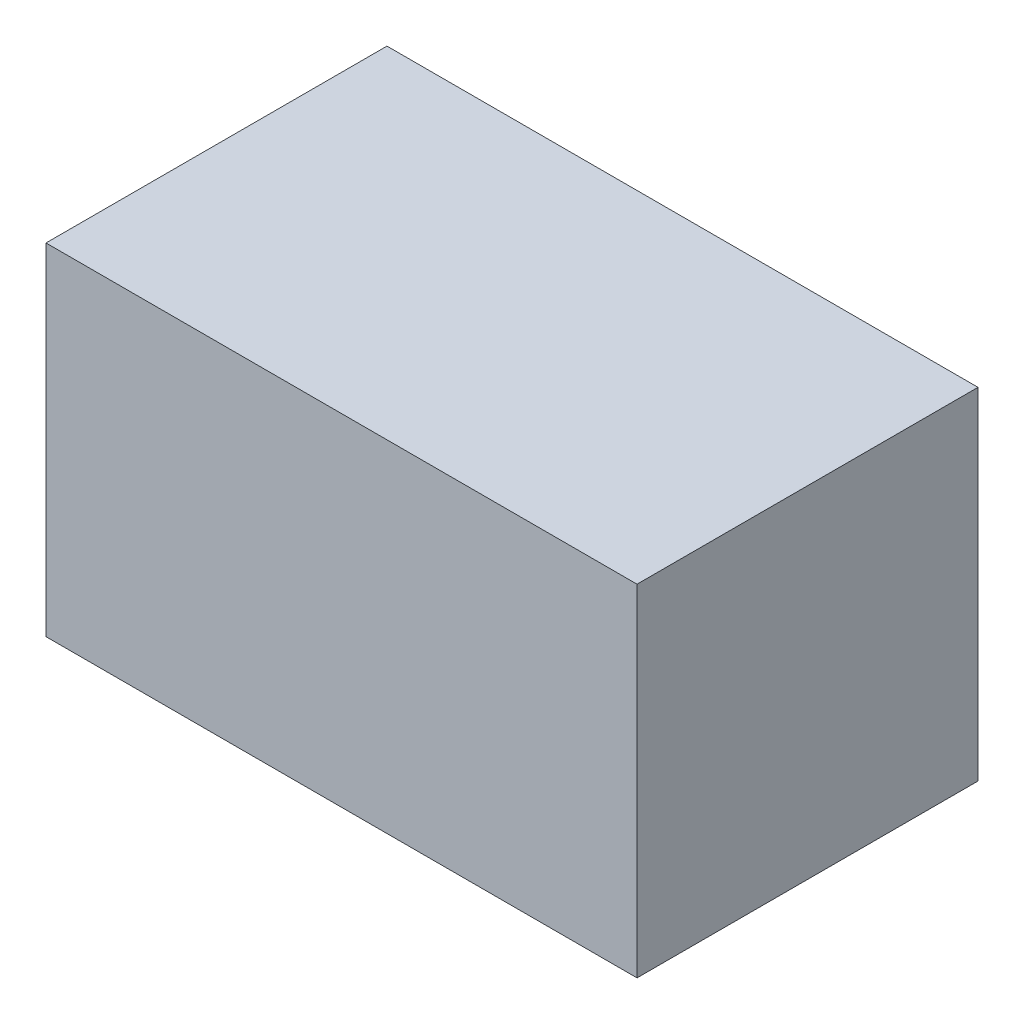
ISO-10303-21;
HEADER;
FILE_DESCRIPTION(('STEP AP214'),'2;1');
FILE_NAME('part.step','',(''),(''),'','','');
FILE_SCHEMA(('AUTOMOTIVE_DESIGN { 1 0 10303 214 1 1 1 1 }'));
ENDSEC;
DATA;
#1=APPLICATION_CONTEXT('core data for automotive mechanical design processes');
#2=APPLICATION_PROTOCOL_DEFINITION('international standard','automotive_design',2000,#1);
#3=PRODUCT_CONTEXT('',#1,'mechanical');
#4=PRODUCT('Part','Part','',(#3));
#5=PRODUCT_RELATED_PRODUCT_CATEGORY('part','',(#4));
#6=PRODUCT_DEFINITION_FORMATION('','',#4);
#7=PRODUCT_DEFINITION_CONTEXT('part definition',#1,'design');
#8=PRODUCT_DEFINITION('design','',#6,#7);
#9=PRODUCT_DEFINITION_SHAPE('','',#8);
#10=(LENGTH_UNIT() NAMED_UNIT(*) SI_UNIT(.MILLI.,.METRE.));
#11=(NAMED_UNIT(*) PLANE_ANGLE_UNIT() SI_UNIT($,.RADIAN.));
#12=(NAMED_UNIT(*) SI_UNIT($,.STERADIAN.) SOLID_ANGLE_UNIT());
#13=UNCERTAINTY_MEASURE_WITH_UNIT(LENGTH_MEASURE(1.E-05),#10,'distance_accuracy_value','');
#14=(GEOMETRIC_REPRESENTATION_CONTEXT(3) GLOBAL_UNCERTAINTY_ASSIGNED_CONTEXT((#13)) GLOBAL_UNIT_ASSIGNED_CONTEXT((#10,
#11,#12)) REPRESENTATION_CONTEXT('',''));
#15=CARTESIAN_POINT('',(0.,0.,0.));
#16=DIRECTION('',(0.,0.,1.));
#17=DIRECTION('',(1.,0.,0.));
#18=AXIS2_PLACEMENT_3D('',#15,#16,#17);
#19=CARTESIAN_POINT('',(0.,0.,75.));
#20=DIRECTION('',(1.,0.,0.));
#21=DIRECTION('',(0.,1.,0.));
#22=AXIS2_PLACEMENT_3D('',#19,#20,#21);
#23=PLANE('',#22);
#24=DIRECTION('',(0.,-1.,0.));
#25=VECTOR('',#24,1.);
#26=CARTESIAN_POINT('',(0.,0.,0.));
#27=LINE('',#26,#25);
#28=CARTESIAN_POINT('',(0.,0.,0.));
#29=VERTEX_POINT('',#28);
#30=CARTESIAN_POINT('',(0.,-75.,0.));
#31=VERTEX_POINT('',#30);
#32=EDGE_CURVE('E100',#29,#31,#27,.T.);
#33=ORIENTED_EDGE('',*,*,#32,.T.);
#34=DIRECTION('',(0.,0.,-1.));
#35=VECTOR('',#34,1.);
#36=CARTESIAN_POINT('',(0.,-75.,75.));
#37=LINE('',#36,#35);
#38=CARTESIAN_POINT('',(0.,-75.,75.));
#39=VERTEX_POINT('',#38);
#40=EDGE_CURVE('E11',#39,#31,#37,.T.);
#41=ORIENTED_EDGE('',*,*,#40,.F.);
#42=DIRECTION('',(0.,-1.,0.));
#43=VECTOR('',#42,1.);
#44=CARTESIAN_POINT('',(0.,0.,75.));
#45=LINE('',#44,#43);
#46=CARTESIAN_POINT('',(0.,0.,75.));
#47=VERTEX_POINT('',#46);
#48=EDGE_CURVE('E88',#47,#39,#45,.T.);
#49=ORIENTED_EDGE('',*,*,#48,.F.);
#50=DIRECTION('',(0.,0.,-1.));
#51=VECTOR('',#50,1.);
#52=CARTESIAN_POINT('',(0.,0.,75.));
#53=LINE('',#52,#51);
#54=EDGE_CURVE('E96',#47,#29,#53,.T.);
#55=ORIENTED_EDGE('',*,*,#54,.T.);
#56=EDGE_LOOP('',(#33,#41,#49,#55));
#57=FACE_BOUND('',#56,.T.);
#58=ADVANCED_FACE('F37',(#57),#23,.F.);
#59=CARTESIAN_POINT('',(0.,-75.,75.));
#60=DIRECTION('',(0.,1.,0.));
#61=DIRECTION('',(0.,0.,1.));
#62=AXIS2_PLACEMENT_3D('',#59,#60,#61);
#63=PLANE('',#62);
#64=DIRECTION('',(1.,0.,0.));
#65=VECTOR('',#64,1.);
#66=CARTESIAN_POINT('',(0.,-75.,0.));
#67=LINE('',#66,#65);
#68=CARTESIAN_POINT('',(130.,-75.,0.));
#69=VERTEX_POINT('',#68);
#70=EDGE_CURVE('E92',#31,#69,#67,.T.);
#71=ORIENTED_EDGE('',*,*,#70,.T.);
#72=DIRECTION('',(0.,0.,-1.));
#73=VECTOR('',#72,1.);
#74=CARTESIAN_POINT('',(130.,-75.,75.));
#75=LINE('',#74,#73);
#76=CARTESIAN_POINT('',(130.,-75.,75.));
#77=VERTEX_POINT('',#76);
#78=EDGE_CURVE('E45',#77,#69,#75,.T.);
#79=ORIENTED_EDGE('',*,*,#78,.F.);
#80=DIRECTION('',(1.,0.,0.));
#81=VECTOR('',#80,1.);
#82=CARTESIAN_POINT('',(0.,-75.,75.));
#83=LINE('',#82,#81);
#84=EDGE_CURVE('E83',#39,#77,#83,.T.);
#85=ORIENTED_EDGE('',*,*,#84,.F.);
#86=ORIENTED_EDGE('',*,*,#40,.T.);
#87=EDGE_LOOP('',(#71,#79,#85,#86));
#88=FACE_BOUND('',#87,.T.);
#89=ADVANCED_FACE('F91',(#88),#63,.F.);
#90=CARTESIAN_POINT('',(130.,0.,75.));
#91=DIRECTION('',(-1.,0.,0.));
#92=DIRECTION('',(0.,0.,1.));
#93=AXIS2_PLACEMENT_3D('',#90,#91,#92);
#94=PLANE('',#93);
#95=DIRECTION('',(0.,1.,0.));
#96=VECTOR('',#95,1.);
#97=CARTESIAN_POINT('',(130.,0.,0.));
#98=LINE('',#97,#96);
#99=CARTESIAN_POINT('',(130.,0.,0.));
#100=VERTEX_POINT('',#99);
#101=EDGE_CURVE('E70',#69,#100,#98,.T.);
#102=ORIENTED_EDGE('',*,*,#101,.T.);
#103=DIRECTION('',(0.,0.,-1.));
#104=VECTOR('',#103,1.);
#105=CARTESIAN_POINT('',(130.,0.,75.));
#106=LINE('',#105,#104);
#107=CARTESIAN_POINT('',(130.,0.,75.));
#108=VERTEX_POINT('',#107);
#109=EDGE_CURVE('E93',#108,#100,#106,.T.);
#110=ORIENTED_EDGE('',*,*,#109,.F.);
#111=DIRECTION('',(0.,1.,0.));
#112=VECTOR('',#111,1.);
#113=CARTESIAN_POINT('',(130.,0.,75.));
#114=LINE('',#113,#112);
#115=EDGE_CURVE('E86',#77,#108,#114,.T.);
#116=ORIENTED_EDGE('',*,*,#115,.F.);
#117=ORIENTED_EDGE('',*,*,#78,.T.);
#118=EDGE_LOOP('',(#102,#110,#116,#117));
#119=FACE_BOUND('',#118,.T.);
#120=ADVANCED_FACE('F94',(#119),#94,.F.);
#121=CARTESIAN_POINT('',(0.,0.,75.));
#122=DIRECTION('',(0.,-1.,0.));
#123=DIRECTION('',(0.,0.,-1.));
#124=AXIS2_PLACEMENT_3D('',#121,#122,#123);
#125=PLANE('',#124);
#126=DIRECTION('',(-1.,0.,0.));
#127=VECTOR('',#126,1.);
#128=CARTESIAN_POINT('',(0.,0.,0.));
#129=LINE('',#128,#127);
#130=EDGE_CURVE('E76',#100,#29,#129,.T.);
#131=ORIENTED_EDGE('',*,*,#130,.T.);
#132=ORIENTED_EDGE('',*,*,#54,.F.);
#133=DIRECTION('',(-1.,0.,0.));
#134=VECTOR('',#133,1.);
#135=CARTESIAN_POINT('',(0.,0.,75.));
#136=LINE('',#135,#134);
#137=EDGE_CURVE('E53',#108,#47,#136,.T.);
#138=ORIENTED_EDGE('',*,*,#137,.F.);
#139=ORIENTED_EDGE('',*,*,#109,.T.);
#140=EDGE_LOOP('',(#131,#132,#138,#139));
#141=FACE_BOUND('',#140,.T.);
#142=ADVANCED_FACE('F107',(#141),#125,.F.);
#143=CARTESIAN_POINT('',(0.,0.,75.));
#144=DIRECTION('',(0.,0.,1.));
#145=DIRECTION('',(1.,0.,0.));
#146=AXIS2_PLACEMENT_3D('',#143,#144,#145);
#147=PLANE('',#146);
#148=ORIENTED_EDGE('',*,*,#48,.T.);
#149=ORIENTED_EDGE('',*,*,#84,.T.);
#150=ORIENTED_EDGE('',*,*,#115,.T.);
#151=ORIENTED_EDGE('',*,*,#137,.T.);
#152=EDGE_LOOP('',(#148,#149,#150,#151));
#153=FACE_BOUND('',#152,.T.);
#154=ADVANCED_FACE('F84',(#153),#147,.T.);
#155=CARTESIAN_POINT('',(0.,0.,0.));
#156=DIRECTION('',(0.,0.,1.));
#157=DIRECTION('',(1.,0.,0.));
#158=AXIS2_PLACEMENT_3D('',#155,#156,#157);
#159=PLANE('',#158);
#160=ORIENTED_EDGE('',*,*,#32,.F.);
#161=ORIENTED_EDGE('',*,*,#130,.F.);
#162=ORIENTED_EDGE('',*,*,#101,.F.);
#163=ORIENTED_EDGE('',*,*,#70,.F.);
#164=EDGE_LOOP('',(#160,#161,#162,#163));
#165=FACE_BOUND('',#164,.T.);
#166=ADVANCED_FACE('F110',(#165),#159,.F.);
#167=CLOSED_SHELL('',(#58,#89,#120,#142,#154,#166));
#168=MANIFOLD_SOLID_BREP('B2',#167);
#169=ADVANCED_BREP_SHAPE_REPRESENTATION('',(#18,#168),#14);
#170=SHAPE_DEFINITION_REPRESENTATION(#9,#169);
ENDSEC;
END-ISO-10303-21;
